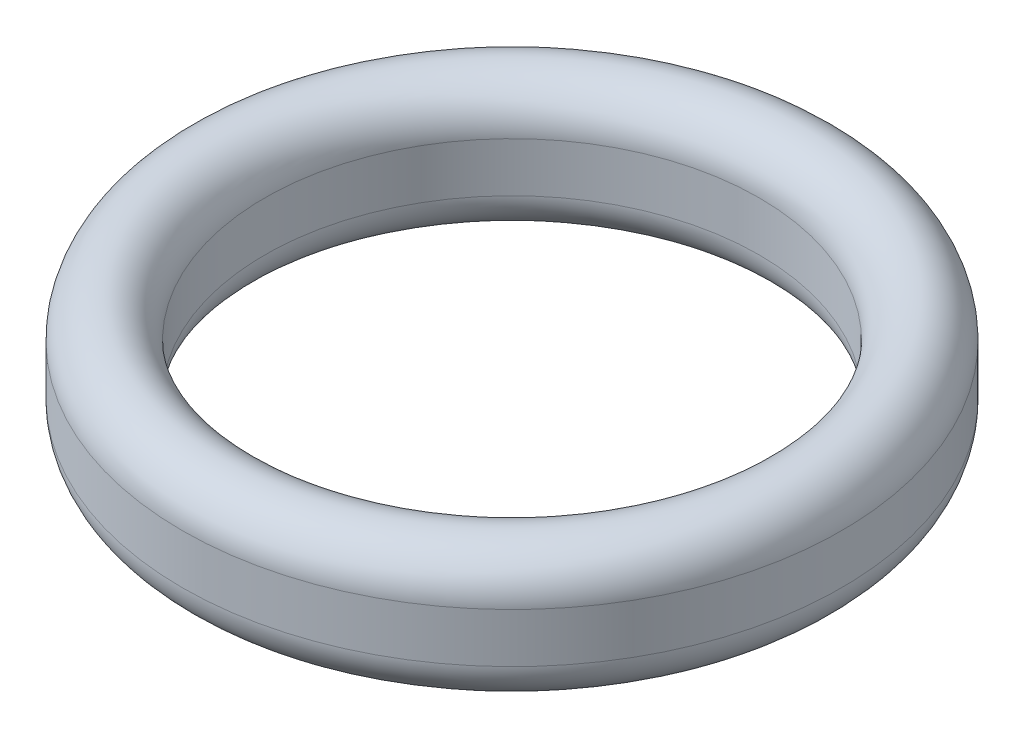
ISO-10303-21;
HEADER;
FILE_DESCRIPTION(('STEP AP214'),'2;1');
FILE_NAME('part.step','',(''),(''),'','','');
FILE_SCHEMA(('AUTOMOTIVE_DESIGN { 1 0 10303 214 1 1 1 1 }'));
ENDSEC;
DATA;
#1=APPLICATION_CONTEXT('core data for automotive mechanical design processes');
#2=APPLICATION_PROTOCOL_DEFINITION('international standard','automotive_design',2000,#1);
#3=PRODUCT_CONTEXT('',#1,'mechanical');
#4=PRODUCT('Part','Part','',(#3));
#5=PRODUCT_RELATED_PRODUCT_CATEGORY('part','',(#4));
#6=PRODUCT_DEFINITION_FORMATION('','',#4);
#7=PRODUCT_DEFINITION_CONTEXT('part definition',#1,'design');
#8=PRODUCT_DEFINITION('design','',#6,#7);
#9=PRODUCT_DEFINITION_SHAPE('','',#8);
#10=(LENGTH_UNIT() NAMED_UNIT(*) SI_UNIT(.MILLI.,.METRE.));
#11=(NAMED_UNIT(*) PLANE_ANGLE_UNIT() SI_UNIT($,.RADIAN.));
#12=(NAMED_UNIT(*) SI_UNIT($,.STERADIAN.) SOLID_ANGLE_UNIT());
#13=UNCERTAINTY_MEASURE_WITH_UNIT(LENGTH_MEASURE(1.E-05),#10,'distance_accuracy_value','');
#14=(GEOMETRIC_REPRESENTATION_CONTEXT(3) GLOBAL_UNCERTAINTY_ASSIGNED_CONTEXT((#13)) GLOBAL_UNIT_ASSIGNED_CONTEXT((#10,
#11,#12)) REPRESENTATION_CONTEXT('',''));
#15=CARTESIAN_POINT('',(0.,0.,0.));
#16=DIRECTION('',(0.,0.,1.));
#17=DIRECTION('',(1.,0.,0.));
#18=AXIS2_PLACEMENT_3D('',#15,#16,#17);
#19=CARTESIAN_POINT('',(0.,2.6,0.));
#20=DIRECTION('',(0.,-1.,0.));
#21=DIRECTION('',(0.,0.,-1.));
#22=AXIS2_PLACEMENT_3D('',#19,#20,#21);
#23=CYLINDRICAL_SURFACE('',#22,4.);
#24=CARTESIAN_POINT('',(0.,0.999998460835509,0.));
#25=DIRECTION('',(0.,-1.,0.));
#26=DIRECTION('',(0.,0.,-1.));
#27=AXIS2_PLACEMENT_3D('',#24,#25,#26);
#28=CIRCLE('',#27,4.);
#29=CARTESIAN_POINT('',(0.,0.999998460835509,-4.));
#30=VERTEX_POINT('',#29);
#31=EDGE_CURVE('E10',#30,#30,#28,.F.);
#32=ORIENTED_EDGE('',*,*,#31,.T.);
#33=EDGE_LOOP('',(#32));
#34=FACE_BOUND('',#33,.T.);
#35=CARTESIAN_POINT('',(0.,1.60000153916449,0.));
#36=DIRECTION('',(0.,-1.,0.));
#37=DIRECTION('',(0.,0.,-1.));
#38=AXIS2_PLACEMENT_3D('',#35,#36,#37);
#39=CIRCLE('',#38,4.);
#40=CARTESIAN_POINT('',(0.,1.60000153916449,-4.));
#41=VERTEX_POINT('',#40);
#42=EDGE_CURVE('E52',#41,#41,#39,.T.);
#43=ORIENTED_EDGE('',*,*,#42,.T.);
#44=EDGE_LOOP('',(#43));
#45=FACE_BOUND('',#44,.T.);
#46=ADVANCED_FACE('F44',(#34,#45),#23,.T.);
#47=CARTESIAN_POINT('',(0.,2.6,0.));
#48=DIRECTION('',(0.,-1.,0.));
#49=DIRECTION('',(0.,0.,-1.));
#50=AXIS2_PLACEMENT_3D('',#47,#48,#49);
#51=CYLINDRICAL_SURFACE('',#50,3.);
#52=CARTESIAN_POINT('',(0.,1.,0.));
#53=DIRECTION('',(0.,1.,0.));
#54=DIRECTION('',(0.,0.,1.));
#55=AXIS2_PLACEMENT_3D('',#52,#53,#54);
#56=CIRCLE('',#55,3.);
#57=CARTESIAN_POINT('',(0.,1.,3.));
#58=VERTEX_POINT('',#57);
#59=EDGE_CURVE('E58',#58,#58,#56,.F.);
#60=ORIENTED_EDGE('',*,*,#59,.T.);
#61=EDGE_LOOP('',(#60));
#62=FACE_BOUND('',#61,.T.);
#63=CARTESIAN_POINT('',(0.,1.6,0.));
#64=DIRECTION('',(0.,1.,0.));
#65=DIRECTION('',(0.,0.,1.));
#66=AXIS2_PLACEMENT_3D('',#63,#64,#65);
#67=CIRCLE('',#66,3.);
#68=CARTESIAN_POINT('',(0.,1.6,3.));
#69=VERTEX_POINT('',#68);
#70=EDGE_CURVE('E64',#69,#69,#67,.T.);
#71=ORIENTED_EDGE('',*,*,#70,.T.);
#72=EDGE_LOOP('',(#71));
#73=FACE_BOUND('',#72,.T.);
#74=ADVANCED_FACE('F72',(#62,#73),#51,.F.);
#75=CARTESIAN_POINT('',(0.,0.999998460835509,0.));
#76=DIRECTION('',(0.,-1.,0.));
#77=DIRECTION('',(0.,0.,-1.));
#78=AXIS2_PLACEMENT_3D('',#75,#76,#77);
#79=TOROIDAL_SURFACE('',#78,3.50000000000118,0.5);
#80=ORIENTED_EDGE('',*,*,#59,.F.);
#81=EDGE_LOOP('',(#80));
#82=FACE_BOUND('',#81,.T.);
#83=ORIENTED_EDGE('',*,*,#31,.F.);
#84=EDGE_LOOP('',(#83));
#85=FACE_BOUND('',#84,.T.);
#86=ADVANCED_FACE('F75',(#82,#85),#79,.T.);
#87=CARTESIAN_POINT('',(0.,1.60000153916449,0.));
#88=DIRECTION('',(0.,-1.,0.));
#89=DIRECTION('',(0.,0.,-1.));
#90=AXIS2_PLACEMENT_3D('',#87,#88,#89);
#91=TOROIDAL_SURFACE('',#90,3.50000000000118,0.5);
#92=ORIENTED_EDGE('',*,*,#42,.F.);
#93=EDGE_LOOP('',(#92));
#94=FACE_BOUND('',#93,.T.);
#95=ORIENTED_EDGE('',*,*,#70,.F.);
#96=EDGE_LOOP('',(#95));
#97=FACE_BOUND('',#96,.T.);
#98=ADVANCED_FACE('F46',(#94,#97),#91,.T.);
#99=CLOSED_SHELL('',(#46,#74,#86,#98));
#100=MANIFOLD_SOLID_BREP('B2',#99);
#101=ADVANCED_BREP_SHAPE_REPRESENTATION('',(#18,#100),#14);
#102=SHAPE_DEFINITION_REPRESENTATION(#9,#101);
ENDSEC;
END-ISO-10303-21;
